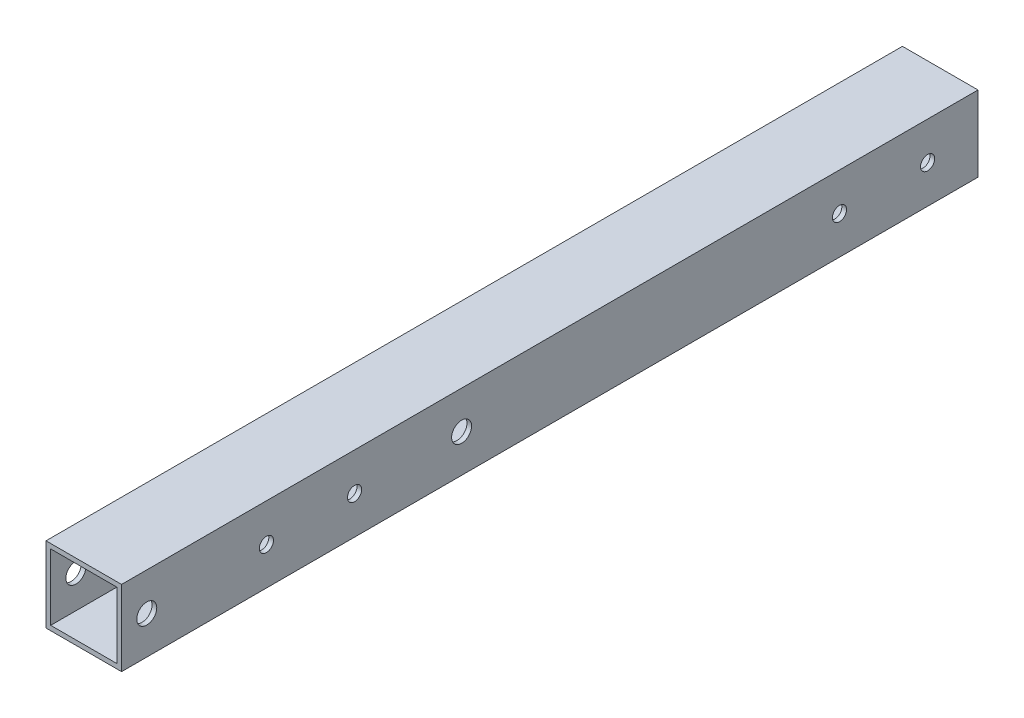
ISO-10303-21;
HEADER;
FILE_DESCRIPTION(('STEP AP214'),'2;1');
FILE_NAME('part.step','',(''),(''),'','','');
FILE_SCHEMA(('AUTOMOTIVE_DESIGN { 1 0 10303 214 1 1 1 1 }'));
ENDSEC;
DATA;
#1=APPLICATION_CONTEXT('core data for automotive mechanical design processes');
#2=APPLICATION_PROTOCOL_DEFINITION('international standard','automotive_design',2000,#1);
#3=PRODUCT_CONTEXT('',#1,'mechanical');
#4=PRODUCT('Part','Part','',(#3));
#5=PRODUCT_RELATED_PRODUCT_CATEGORY('part','',(#4));
#6=PRODUCT_DEFINITION_FORMATION('','',#4);
#7=PRODUCT_DEFINITION_CONTEXT('part definition',#1,'design');
#8=PRODUCT_DEFINITION('design','',#6,#7);
#9=PRODUCT_DEFINITION_SHAPE('','',#8);
#10=(LENGTH_UNIT() NAMED_UNIT(*) SI_UNIT(.MILLI.,.METRE.));
#11=(NAMED_UNIT(*) PLANE_ANGLE_UNIT() SI_UNIT($,.RADIAN.));
#12=(NAMED_UNIT(*) SI_UNIT($,.STERADIAN.) SOLID_ANGLE_UNIT());
#13=UNCERTAINTY_MEASURE_WITH_UNIT(LENGTH_MEASURE(1.E-05),#10,'distance_accuracy_value','');
#14=(GEOMETRIC_REPRESENTATION_CONTEXT(3) GLOBAL_UNCERTAINTY_ASSIGNED_CONTEXT((#13)) GLOBAL_UNIT_ASSIGNED_CONTEXT((#10,
#11,#12)) REPRESENTATION_CONTEXT('',''));
#15=CARTESIAN_POINT('',(0.,0.,0.));
#16=DIRECTION('',(0.,0.,1.));
#17=DIRECTION('',(1.,0.,0.));
#18=AXIS2_PLACEMENT_3D('',#15,#16,#17);
#19=CARTESIAN_POINT('',(19.05,19.05,431.8));
#20=DIRECTION('',(0.,0.,-1.));
#21=DIRECTION('',(-1.,0.,0.));
#22=AXIS2_PLACEMENT_3D('',#19,#20,#21);
#23=PLANE('',#22);
#24=DIRECTION('',(0.,1.,0.));
#25=VECTOR('',#24,1.);
#26=CARTESIAN_POINT('',(19.05,-19.05,431.8));
#27=LINE('',#26,#25);
#28=CARTESIAN_POINT('',(19.05,-19.05,431.8));
#29=VERTEX_POINT('',#28);
#30=CARTESIAN_POINT('',(19.05,19.05,431.8));
#31=VERTEX_POINT('',#30);
#32=EDGE_CURVE('E144',#29,#31,#27,.T.);
#33=ORIENTED_EDGE('',*,*,#32,.T.);
#34=DIRECTION('',(-1.,0.,0.));
#35=VECTOR('',#34,1.);
#36=CARTESIAN_POINT('',(-19.05,19.05,431.8));
#37=LINE('',#36,#35);
#38=CARTESIAN_POINT('',(-19.05,19.05,431.8));
#39=VERTEX_POINT('',#38);
#40=EDGE_CURVE('E147',#31,#39,#37,.T.);
#41=ORIENTED_EDGE('',*,*,#40,.T.);
#42=DIRECTION('',(0.,-1.,0.));
#43=VECTOR('',#42,1.);
#44=CARTESIAN_POINT('',(-19.05,-19.05,431.8));
#45=LINE('',#44,#43);
#46=CARTESIAN_POINT('',(-19.05,-19.05,431.8));
#47=VERTEX_POINT('',#46);
#48=EDGE_CURVE('E150',#39,#47,#45,.T.);
#49=ORIENTED_EDGE('',*,*,#48,.T.);
#50=DIRECTION('',(1.,0.,0.));
#51=VECTOR('',#50,1.);
#52=CARTESIAN_POINT('',(-19.05,-19.05,431.8));
#53=LINE('',#52,#51);
#54=EDGE_CURVE('E152',#47,#29,#53,.T.);
#55=ORIENTED_EDGE('',*,*,#54,.T.);
#56=EDGE_LOOP('',(#33,#41,#49,#55));
#57=FACE_BOUND('',#56,.T.);
#58=DIRECTION('',(0.,1.,0.));
#59=VECTOR('',#58,1.);
#60=CARTESIAN_POINT('',(16.6878,-16.6878,431.8));
#61=LINE('',#60,#59);
#62=CARTESIAN_POINT('',(16.6878,-16.6878,431.8));
#63=VERTEX_POINT('',#62);
#64=CARTESIAN_POINT('',(16.6878,16.6878,431.8));
#65=VERTEX_POINT('',#64);
#66=EDGE_CURVE('E106',#63,#65,#61,.T.);
#67=ORIENTED_EDGE('',*,*,#66,.F.);
#68=DIRECTION('',(1.,0.,0.));
#69=VECTOR('',#68,1.);
#70=CARTESIAN_POINT('',(-16.6878,-16.6878,431.8));
#71=LINE('',#70,#69);
#72=CARTESIAN_POINT('',(-16.6878,-16.6878,431.8));
#73=VERTEX_POINT('',#72);
#74=EDGE_CURVE('E128',#73,#63,#71,.T.);
#75=ORIENTED_EDGE('',*,*,#74,.F.);
#76=DIRECTION('',(0.,-1.,0.));
#77=VECTOR('',#76,1.);
#78=CARTESIAN_POINT('',(-16.6878,-16.6878,431.8));
#79=LINE('',#78,#77);
#80=CARTESIAN_POINT('',(-16.6878,16.6878,431.8));
#81=VERTEX_POINT('',#80);
#82=EDGE_CURVE('E126',#81,#73,#79,.T.);
#83=ORIENTED_EDGE('',*,*,#82,.F.);
#84=DIRECTION('',(-1.,0.,0.));
#85=VECTOR('',#84,1.);
#86=CARTESIAN_POINT('',(-16.6878,16.6878,431.8));
#87=LINE('',#86,#85);
#88=EDGE_CURVE('E114',#65,#81,#87,.T.);
#89=ORIENTED_EDGE('',*,*,#88,.F.);
#90=EDGE_LOOP('',(#67,#75,#83,#89));
#91=FACE_BOUND('',#90,.T.);
#92=ADVANCED_FACE('F39',(#57,#91),#23,.F.);
#93=CARTESIAN_POINT('',(19.05,19.05,0.));
#94=DIRECTION('',(0.,0.,-1.));
#95=DIRECTION('',(-1.,0.,0.));
#96=AXIS2_PLACEMENT_3D('',#93,#94,#95);
#97=PLANE('',#96);
#98=DIRECTION('',(0.,1.,0.));
#99=VECTOR('',#98,1.);
#100=CARTESIAN_POINT('',(19.05,-19.05,0.));
#101=LINE('',#100,#99);
#102=CARTESIAN_POINT('',(19.05,-19.05,0.));
#103=VERTEX_POINT('',#102);
#104=CARTESIAN_POINT('',(19.05,19.05,0.));
#105=VERTEX_POINT('',#104);
#106=EDGE_CURVE('E122',#103,#105,#101,.T.);
#107=ORIENTED_EDGE('',*,*,#106,.F.);
#108=DIRECTION('',(1.,0.,0.));
#109=VECTOR('',#108,1.);
#110=CARTESIAN_POINT('',(-19.05,-19.05,0.));
#111=LINE('',#110,#109);
#112=CARTESIAN_POINT('',(-19.05,-19.05,0.));
#113=VERTEX_POINT('',#112);
#114=EDGE_CURVE('E148',#113,#103,#111,.T.);
#115=ORIENTED_EDGE('',*,*,#114,.F.);
#116=DIRECTION('',(0.,-1.,0.));
#117=VECTOR('',#116,1.);
#118=CARTESIAN_POINT('',(-19.05,-19.05,0.));
#119=LINE('',#118,#117);
#120=CARTESIAN_POINT('',(-19.05,19.05,0.));
#121=VERTEX_POINT('',#120);
#122=EDGE_CURVE('E159',#121,#113,#119,.T.);
#123=ORIENTED_EDGE('',*,*,#122,.F.);
#124=DIRECTION('',(-1.,0.,0.));
#125=VECTOR('',#124,1.);
#126=CARTESIAN_POINT('',(-19.05,19.05,0.));
#127=LINE('',#126,#125);
#128=EDGE_CURVE('E157',#105,#121,#127,.T.);
#129=ORIENTED_EDGE('',*,*,#128,.F.);
#130=EDGE_LOOP('',(#107,#115,#123,#129));
#131=FACE_BOUND('',#130,.T.);
#132=DIRECTION('',(1.,0.,0.));
#133=VECTOR('',#132,1.);
#134=CARTESIAN_POINT('',(-16.6878,-16.6878,0.));
#135=LINE('',#134,#133);
#136=CARTESIAN_POINT('',(-16.6878,-16.6878,0.));
#137=VERTEX_POINT('',#136);
#138=CARTESIAN_POINT('',(16.6878,-16.6878,0.));
#139=VERTEX_POINT('',#138);
#140=EDGE_CURVE('E115',#137,#139,#135,.T.);
#141=ORIENTED_EDGE('',*,*,#140,.T.);
#142=DIRECTION('',(0.,1.,0.));
#143=VECTOR('',#142,1.);
#144=CARTESIAN_POINT('',(16.6878,-16.6878,0.));
#145=LINE('',#144,#143);
#146=CARTESIAN_POINT('',(16.6878,16.6878,0.));
#147=VERTEX_POINT('',#146);
#148=EDGE_CURVE('E64',#139,#147,#145,.T.);
#149=ORIENTED_EDGE('',*,*,#148,.T.);
#150=DIRECTION('',(-1.,0.,0.));
#151=VECTOR('',#150,1.);
#152=CARTESIAN_POINT('',(-16.6878,16.6878,0.));
#153=LINE('',#152,#151);
#154=CARTESIAN_POINT('',(-16.6878,16.6878,0.));
#155=VERTEX_POINT('',#154);
#156=EDGE_CURVE('E121',#147,#155,#153,.T.);
#157=ORIENTED_EDGE('',*,*,#156,.T.);
#158=DIRECTION('',(0.,-1.,0.));
#159=VECTOR('',#158,1.);
#160=CARTESIAN_POINT('',(-16.6878,-16.6878,0.));
#161=LINE('',#160,#159);
#162=EDGE_CURVE('E136',#155,#137,#161,.T.);
#163=ORIENTED_EDGE('',*,*,#162,.T.);
#164=EDGE_LOOP('',(#141,#149,#157,#163));
#165=FACE_BOUND('',#164,.T.);
#166=ADVANCED_FACE('F253',(#131,#165),#97,.T.);
#167=CARTESIAN_POINT('',(19.05,-19.05,431.8));
#168=DIRECTION('',(-1.,0.,0.));
#169=DIRECTION('',(0.,-1.,0.));
#170=AXIS2_PLACEMENT_3D('',#167,#168,#169);
#171=PLANE('',#170);
#172=CARTESIAN_POINT('',(19.05,0.,419.1));
#173=DIRECTION('',(1.,0.,0.));
#174=DIRECTION('',(0.,0.,-1.));
#175=AXIS2_PLACEMENT_3D('',#172,#173,#174);
#176=CIRCLE('',#175,5.04189999999999);
#177=CARTESIAN_POINT('',(19.05,0.,414.0581));
#178=VERTEX_POINT('',#177);
#179=EDGE_CURVE('E332',#178,#178,#176,.T.);
#180=ORIENTED_EDGE('',*,*,#179,.F.);
#181=EDGE_LOOP('',(#180));
#182=FACE_BOUND('',#181,.T.);
#183=CARTESIAN_POINT('',(19.05,0.,260.35));
#184=DIRECTION('',(1.,0.,0.));
#185=DIRECTION('',(0.,0.,-1.));
#186=AXIS2_PLACEMENT_3D('',#183,#184,#185);
#187=CIRCLE('',#186,5.04189999999999);
#188=CARTESIAN_POINT('',(19.05,0.,255.3081));
#189=VERTEX_POINT('',#188);
#190=EDGE_CURVE('E197',#189,#189,#187,.T.);
#191=ORIENTED_EDGE('',*,*,#190,.F.);
#192=EDGE_LOOP('',(#191));
#193=FACE_BOUND('',#192,.T.);
#194=CARTESIAN_POINT('',(19.05,0.,358.775));
#195=DIRECTION('',(1.,0.,0.));
#196=DIRECTION('',(0.,0.,-1.));
#197=AXIS2_PLACEMENT_3D('',#194,#195,#196);
#198=CIRCLE('',#197,3.57123999999999);
#199=CARTESIAN_POINT('',(19.05,0.,355.20376));
#200=VERTEX_POINT('',#199);
#201=EDGE_CURVE('E194',#200,#200,#198,.T.);
#202=ORIENTED_EDGE('',*,*,#201,.F.);
#203=EDGE_LOOP('',(#202));
#204=FACE_BOUND('',#203,.T.);
#205=CARTESIAN_POINT('',(19.05,0.,314.325));
#206=DIRECTION('',(1.,0.,0.));
#207=DIRECTION('',(0.,0.,-1.));
#208=AXIS2_PLACEMENT_3D('',#205,#206,#207);
#209=CIRCLE('',#208,3.57123999999999);
#210=CARTESIAN_POINT('',(19.05,0.,310.75376));
#211=VERTEX_POINT('',#210);
#212=EDGE_CURVE('E212',#211,#211,#209,.T.);
#213=ORIENTED_EDGE('',*,*,#212,.F.);
#214=EDGE_LOOP('',(#213));
#215=FACE_BOUND('',#214,.T.);
#216=CARTESIAN_POINT('',(19.05,0.,69.85));
#217=DIRECTION('',(1.,0.,0.));
#218=DIRECTION('',(0.,0.,-1.));
#219=AXIS2_PLACEMENT_3D('',#216,#217,#218);
#220=CIRCLE('',#219,3.57123999999999);
#221=CARTESIAN_POINT('',(19.05,0.,66.27876));
#222=VERTEX_POINT('',#221);
#223=EDGE_CURVE('E219',#222,#222,#220,.T.);
#224=ORIENTED_EDGE('',*,*,#223,.F.);
#225=EDGE_LOOP('',(#224));
#226=FACE_BOUND('',#225,.T.);
#227=CARTESIAN_POINT('',(19.05,0.,25.4));
#228=DIRECTION('',(1.,0.,0.));
#229=DIRECTION('',(0.,0.,-1.));
#230=AXIS2_PLACEMENT_3D('',#227,#228,#229);
#231=CIRCLE('',#230,3.57123999999999);
#232=CARTESIAN_POINT('',(19.05,0.,21.82876));
#233=VERTEX_POINT('',#232);
#234=EDGE_CURVE('E226',#233,#233,#231,.T.);
#235=ORIENTED_EDGE('',*,*,#234,.F.);
#236=EDGE_LOOP('',(#235));
#237=FACE_BOUND('',#236,.T.);
#238=ORIENTED_EDGE('',*,*,#106,.T.);
#239=DIRECTION('',(0.,0.,-1.));
#240=VECTOR('',#239,1.);
#241=CARTESIAN_POINT('',(19.05,19.05,431.8));
#242=LINE('',#241,#240);
#243=EDGE_CURVE('E11',#31,#105,#242,.T.);
#244=ORIENTED_EDGE('',*,*,#243,.F.);
#245=ORIENTED_EDGE('',*,*,#32,.F.);
#246=DIRECTION('',(0.,0.,-1.));
#247=VECTOR('',#246,1.);
#248=CARTESIAN_POINT('',(19.05,-19.05,431.8));
#249=LINE('',#248,#247);
#250=EDGE_CURVE('E154',#29,#103,#249,.T.);
#251=ORIENTED_EDGE('',*,*,#250,.T.);
#252=EDGE_LOOP('',(#238,#244,#245,#251));
#253=FACE_BOUND('',#252,.T.);
#254=ADVANCED_FACE('F41',(#182,#193,#204,#215,#226,#237,#253),#171,.F.);
#255=CARTESIAN_POINT('',(-19.05,19.05,431.8));
#256=DIRECTION('',(0.,-1.,0.));
#257=DIRECTION('',(1.,0.,0.));
#258=AXIS2_PLACEMENT_3D('',#255,#256,#257);
#259=PLANE('',#258);
#260=ORIENTED_EDGE('',*,*,#128,.T.);
#261=DIRECTION('',(0.,0.,-1.));
#262=VECTOR('',#261,1.);
#263=CARTESIAN_POINT('',(-19.05,19.05,431.8));
#264=LINE('',#263,#262);
#265=EDGE_CURVE('E48',#39,#121,#264,.T.);
#266=ORIENTED_EDGE('',*,*,#265,.F.);
#267=ORIENTED_EDGE('',*,*,#40,.F.);
#268=ORIENTED_EDGE('',*,*,#243,.T.);
#269=EDGE_LOOP('',(#260,#266,#267,#268));
#270=FACE_BOUND('',#269,.T.);
#271=ADVANCED_FACE('F262',(#270),#259,.F.);
#272=CARTESIAN_POINT('',(-19.05,-19.05,431.8));
#273=DIRECTION('',(1.,0.,0.));
#274=DIRECTION('',(0.,0.,-1.));
#275=AXIS2_PLACEMENT_3D('',#272,#273,#274);
#276=PLANE('',#275);
#277=CARTESIAN_POINT('',(-19.05,0.,419.1));
#278=DIRECTION('',(1.,0.,0.));
#279=DIRECTION('',(0.,0.,-1.));
#280=AXIS2_PLACEMENT_3D('',#277,#278,#279);
#281=CIRCLE('',#280,5.04189999999999);
#282=CARTESIAN_POINT('',(-19.05,0.,414.0581));
#283=VERTEX_POINT('',#282);
#284=EDGE_CURVE('E331',#283,#283,#281,.T.);
#285=ORIENTED_EDGE('',*,*,#284,.T.);
#286=EDGE_LOOP('',(#285));
#287=FACE_BOUND('',#286,.T.);
#288=CARTESIAN_POINT('',(-19.05,0.,260.35));
#289=DIRECTION('',(1.,0.,0.));
#290=DIRECTION('',(0.,0.,-1.));
#291=AXIS2_PLACEMENT_3D('',#288,#289,#290);
#292=CIRCLE('',#291,5.04189999999999);
#293=CARTESIAN_POINT('',(-19.05,0.,255.3081));
#294=VERTEX_POINT('',#293);
#295=EDGE_CURVE('E190',#294,#294,#292,.T.);
#296=ORIENTED_EDGE('',*,*,#295,.T.);
#297=EDGE_LOOP('',(#296));
#298=FACE_BOUND('',#297,.T.);
#299=CARTESIAN_POINT('',(-19.05,0.,358.775));
#300=DIRECTION('',(1.,0.,0.));
#301=DIRECTION('',(0.,0.,-1.));
#302=AXIS2_PLACEMENT_3D('',#299,#300,#301);
#303=CIRCLE('',#302,3.57123999999999);
#304=CARTESIAN_POINT('',(-19.05,0.,355.20376));
#305=VERTEX_POINT('',#304);
#306=EDGE_CURVE('E186',#305,#305,#303,.T.);
#307=ORIENTED_EDGE('',*,*,#306,.T.);
#308=EDGE_LOOP('',(#307));
#309=FACE_BOUND('',#308,.T.);
#310=CARTESIAN_POINT('',(-19.05,0.,314.325));
#311=DIRECTION('',(1.,0.,0.));
#312=DIRECTION('',(0.,0.,-1.));
#313=AXIS2_PLACEMENT_3D('',#310,#311,#312);
#314=CIRCLE('',#313,3.57123999999999);
#315=CARTESIAN_POINT('',(-19.05,0.,310.75376));
#316=VERTEX_POINT('',#315);
#317=EDGE_CURVE('E182',#316,#316,#314,.T.);
#318=ORIENTED_EDGE('',*,*,#317,.T.);
#319=EDGE_LOOP('',(#318));
#320=FACE_BOUND('',#319,.T.);
#321=CARTESIAN_POINT('',(-19.05,0.,69.85));
#322=DIRECTION('',(1.,0.,0.));
#323=DIRECTION('',(0.,0.,-1.));
#324=AXIS2_PLACEMENT_3D('',#321,#322,#323);
#325=CIRCLE('',#324,3.57123999999999);
#326=CARTESIAN_POINT('',(-19.05,0.,66.27876));
#327=VERTEX_POINT('',#326);
#328=EDGE_CURVE('E177',#327,#327,#325,.T.);
#329=ORIENTED_EDGE('',*,*,#328,.T.);
#330=EDGE_LOOP('',(#329));
#331=FACE_BOUND('',#330,.T.);
#332=CARTESIAN_POINT('',(-19.05,0.,25.4));
#333=DIRECTION('',(1.,0.,0.));
#334=DIRECTION('',(0.,0.,-1.));
#335=AXIS2_PLACEMENT_3D('',#332,#333,#334);
#336=CIRCLE('',#335,3.57123999999999);
#337=CARTESIAN_POINT('',(-19.05,0.,21.82876));
#338=VERTEX_POINT('',#337);
#339=EDGE_CURVE('E172',#338,#338,#336,.T.);
#340=ORIENTED_EDGE('',*,*,#339,.T.);
#341=EDGE_LOOP('',(#340));
#342=FACE_BOUND('',#341,.T.);
#343=ORIENTED_EDGE('',*,*,#122,.T.);
#344=DIRECTION('',(0.,0.,-1.));
#345=VECTOR('',#344,1.);
#346=CARTESIAN_POINT('',(-19.05,-19.05,431.8));
#347=LINE('',#346,#345);
#348=EDGE_CURVE('E164',#47,#113,#347,.T.);
#349=ORIENTED_EDGE('',*,*,#348,.F.);
#350=ORIENTED_EDGE('',*,*,#48,.F.);
#351=ORIENTED_EDGE('',*,*,#265,.T.);
#352=EDGE_LOOP('',(#343,#349,#350,#351));
#353=FACE_BOUND('',#352,.T.);
#354=ADVANCED_FACE('F246',(#287,#298,#309,#320,#331,#342,#353),#276,.F.);
#355=CARTESIAN_POINT('',(-19.05,-19.05,431.8));
#356=DIRECTION('',(0.,1.,0.));
#357=DIRECTION('',(0.,0.,1.));
#358=AXIS2_PLACEMENT_3D('',#355,#356,#357);
#359=PLANE('',#358);
#360=ORIENTED_EDGE('',*,*,#114,.T.);
#361=ORIENTED_EDGE('',*,*,#250,.F.);
#362=ORIENTED_EDGE('',*,*,#54,.F.);
#363=ORIENTED_EDGE('',*,*,#348,.T.);
#364=EDGE_LOOP('',(#360,#361,#362,#363));
#365=FACE_BOUND('',#364,.T.);
#366=ADVANCED_FACE('F237',(#365),#359,.F.);
#367=CARTESIAN_POINT('',(16.6878,-16.6878,431.8));
#368=DIRECTION('',(-1.,0.,0.));
#369=DIRECTION('',(0.,0.,1.));
#370=AXIS2_PLACEMENT_3D('',#367,#368,#369);
#371=PLANE('',#370);
#372=CARTESIAN_POINT('',(16.6878,0.,419.1));
#373=DIRECTION('',(-1.,0.,0.));
#374=DIRECTION('',(0.,0.,1.));
#375=AXIS2_PLACEMENT_3D('',#372,#373,#374);
#376=CIRCLE('',#375,5.04189999999999);
#377=CARTESIAN_POINT('',(16.6878,0.,424.1419));
#378=VERTEX_POINT('',#377);
#379=EDGE_CURVE('E202',#378,#378,#376,.T.);
#380=ORIENTED_EDGE('',*,*,#379,.F.);
#381=EDGE_LOOP('',(#380));
#382=FACE_BOUND('',#381,.T.);
#383=CARTESIAN_POINT('',(16.6878,0.,260.35));
#384=DIRECTION('',(-1.,0.,0.));
#385=DIRECTION('',(0.,0.,1.));
#386=AXIS2_PLACEMENT_3D('',#383,#384,#385);
#387=CIRCLE('',#386,5.04189999999999);
#388=CARTESIAN_POINT('',(16.6878,0.,265.3919));
#389=VERTEX_POINT('',#388);
#390=EDGE_CURVE('E189',#389,#389,#387,.T.);
#391=ORIENTED_EDGE('',*,*,#390,.F.);
#392=EDGE_LOOP('',(#391));
#393=FACE_BOUND('',#392,.T.);
#394=CARTESIAN_POINT('',(16.6878,0.,358.775));
#395=DIRECTION('',(-1.,0.,0.));
#396=DIRECTION('',(0.,0.,1.));
#397=AXIS2_PLACEMENT_3D('',#394,#395,#396);
#398=CIRCLE('',#397,3.57123999999999);
#399=CARTESIAN_POINT('',(16.6878,0.,362.34624));
#400=VERTEX_POINT('',#399);
#401=EDGE_CURVE('E185',#400,#400,#398,.T.);
#402=ORIENTED_EDGE('',*,*,#401,.F.);
#403=EDGE_LOOP('',(#402));
#404=FACE_BOUND('',#403,.T.);
#405=CARTESIAN_POINT('',(16.6878,0.,314.325));
#406=DIRECTION('',(-1.,0.,0.));
#407=DIRECTION('',(0.,0.,1.));
#408=AXIS2_PLACEMENT_3D('',#405,#406,#407);
#409=CIRCLE('',#408,3.57123999999999);
#410=CARTESIAN_POINT('',(16.6878,0.,317.89624));
#411=VERTEX_POINT('',#410);
#412=EDGE_CURVE('E181',#411,#411,#409,.T.);
#413=ORIENTED_EDGE('',*,*,#412,.F.);
#414=EDGE_LOOP('',(#413));
#415=FACE_BOUND('',#414,.T.);
#416=CARTESIAN_POINT('',(16.6878,0.,69.85));
#417=DIRECTION('',(-1.,0.,0.));
#418=DIRECTION('',(0.,0.,1.));
#419=AXIS2_PLACEMENT_3D('',#416,#417,#418);
#420=CIRCLE('',#419,3.57123999999999);
#421=CARTESIAN_POINT('',(16.6878,0.,73.42124));
#422=VERTEX_POINT('',#421);
#423=EDGE_CURVE('E176',#422,#422,#420,.T.);
#424=ORIENTED_EDGE('',*,*,#423,.F.);
#425=EDGE_LOOP('',(#424));
#426=FACE_BOUND('',#425,.T.);
#427=CARTESIAN_POINT('',(16.6878,0.,25.4));
#428=DIRECTION('',(-1.,0.,0.));
#429=DIRECTION('',(0.,0.,1.));
#430=AXIS2_PLACEMENT_3D('',#427,#428,#429);
#431=CIRCLE('',#430,3.57123999999999);
#432=CARTESIAN_POINT('',(16.6878,0.,28.97124));
#433=VERTEX_POINT('',#432);
#434=EDGE_CURVE('E134',#433,#433,#431,.T.);
#435=ORIENTED_EDGE('',*,*,#434,.F.);
#436=EDGE_LOOP('',(#435));
#437=FACE_BOUND('',#436,.T.);
#438=ORIENTED_EDGE('',*,*,#148,.F.);
#439=DIRECTION('',(0.,0.,-1.));
#440=VECTOR('',#439,1.);
#441=CARTESIAN_POINT('',(16.6878,-16.6878,431.8));
#442=LINE('',#441,#440);
#443=EDGE_CURVE('E110',#63,#139,#442,.T.);
#444=ORIENTED_EDGE('',*,*,#443,.F.);
#445=ORIENTED_EDGE('',*,*,#66,.T.);
#446=DIRECTION('',(0.,0.,-1.));
#447=VECTOR('',#446,1.);
#448=CARTESIAN_POINT('',(16.6878,16.6878,431.8));
#449=LINE('',#448,#447);
#450=EDGE_CURVE('E109',#65,#147,#449,.T.);
#451=ORIENTED_EDGE('',*,*,#450,.T.);
#452=EDGE_LOOP('',(#438,#444,#445,#451));
#453=FACE_BOUND('',#452,.T.);
#454=ADVANCED_FACE('F108',(#382,#393,#404,#415,#426,#437,#453),#371,.T.);
#455=CARTESIAN_POINT('',(-16.6878,16.6878,431.8));
#456=DIRECTION('',(0.,-1.,0.));
#457=DIRECTION('',(0.,0.,-1.));
#458=AXIS2_PLACEMENT_3D('',#455,#456,#457);
#459=PLANE('',#458);
#460=ORIENTED_EDGE('',*,*,#156,.F.);
#461=ORIENTED_EDGE('',*,*,#450,.F.);
#462=ORIENTED_EDGE('',*,*,#88,.T.);
#463=DIRECTION('',(0.,0.,-1.));
#464=VECTOR('',#463,1.);
#465=CARTESIAN_POINT('',(-16.6878,16.6878,431.8));
#466=LINE('',#465,#464);
#467=EDGE_CURVE('E123',#81,#155,#466,.T.);
#468=ORIENTED_EDGE('',*,*,#467,.T.);
#469=EDGE_LOOP('',(#460,#461,#462,#468));
#470=FACE_BOUND('',#469,.T.);
#471=ADVANCED_FACE('F118',(#470),#459,.T.);
#472=CARTESIAN_POINT('',(-16.6878,-16.6878,431.8));
#473=DIRECTION('',(1.,0.,0.));
#474=DIRECTION('',(0.,0.,-1.));
#475=AXIS2_PLACEMENT_3D('',#472,#473,#474);
#476=PLANE('',#475);
#477=CARTESIAN_POINT('',(-16.6878,0.,419.1));
#478=DIRECTION('',(1.,0.,0.));
#479=DIRECTION('',(0.,0.,-1.));
#480=AXIS2_PLACEMENT_3D('',#477,#478,#479);
#481=CIRCLE('',#480,5.04189999999999);
#482=CARTESIAN_POINT('',(-16.6878,0.,414.0581));
#483=VERTEX_POINT('',#482);
#484=EDGE_CURVE('E43',#483,#483,#481,.T.);
#485=ORIENTED_EDGE('',*,*,#484,.F.);
#486=EDGE_LOOP('',(#485));
#487=FACE_BOUND('',#486,.T.);
#488=CARTESIAN_POINT('',(-16.6878,0.,260.35));
#489=DIRECTION('',(1.,0.,0.));
#490=DIRECTION('',(0.,0.,-1.));
#491=AXIS2_PLACEMENT_3D('',#488,#489,#490);
#492=CIRCLE('',#491,5.04189999999999);
#493=CARTESIAN_POINT('',(-16.6878,0.,255.3081));
#494=VERTEX_POINT('',#493);
#495=EDGE_CURVE('E187',#494,#494,#492,.T.);
#496=ORIENTED_EDGE('',*,*,#495,.F.);
#497=EDGE_LOOP('',(#496));
#498=FACE_BOUND('',#497,.T.);
#499=CARTESIAN_POINT('',(-16.6878,0.,358.775));
#500=DIRECTION('',(1.,0.,0.));
#501=DIRECTION('',(0.,0.,-1.));
#502=AXIS2_PLACEMENT_3D('',#499,#500,#501);
#503=CIRCLE('',#502,3.57123999999999);
#504=CARTESIAN_POINT('',(-16.6878,0.,355.20376));
#505=VERTEX_POINT('',#504);
#506=EDGE_CURVE('E183',#505,#505,#503,.T.);
#507=ORIENTED_EDGE('',*,*,#506,.F.);
#508=EDGE_LOOP('',(#507));
#509=FACE_BOUND('',#508,.T.);
#510=CARTESIAN_POINT('',(-16.6878,0.,314.325));
#511=DIRECTION('',(1.,0.,0.));
#512=DIRECTION('',(0.,0.,-1.));
#513=AXIS2_PLACEMENT_3D('',#510,#511,#512);
#514=CIRCLE('',#513,3.57123999999999);
#515=CARTESIAN_POINT('',(-16.6878,0.,310.75376));
#516=VERTEX_POINT('',#515);
#517=EDGE_CURVE('E178',#516,#516,#514,.T.);
#518=ORIENTED_EDGE('',*,*,#517,.F.);
#519=EDGE_LOOP('',(#518));
#520=FACE_BOUND('',#519,.T.);
#521=CARTESIAN_POINT('',(-16.6878,0.,69.85));
#522=DIRECTION('',(1.,0.,0.));
#523=DIRECTION('',(0.,0.,-1.));
#524=AXIS2_PLACEMENT_3D('',#521,#522,#523);
#525=CIRCLE('',#524,3.57123999999999);
#526=CARTESIAN_POINT('',(-16.6878,0.,66.27876));
#527=VERTEX_POINT('',#526);
#528=EDGE_CURVE('E173',#527,#527,#525,.T.);
#529=ORIENTED_EDGE('',*,*,#528,.F.);
#530=EDGE_LOOP('',(#529));
#531=FACE_BOUND('',#530,.T.);
#532=CARTESIAN_POINT('',(-16.6878,0.,25.4));
#533=DIRECTION('',(1.,0.,0.));
#534=DIRECTION('',(0.,0.,-1.));
#535=AXIS2_PLACEMENT_3D('',#532,#533,#534);
#536=CIRCLE('',#535,3.57123999999999);
#537=CARTESIAN_POINT('',(-16.6878,0.,21.82876));
#538=VERTEX_POINT('',#537);
#539=EDGE_CURVE('E169',#538,#538,#536,.T.);
#540=ORIENTED_EDGE('',*,*,#539,.F.);
#541=EDGE_LOOP('',(#540));
#542=FACE_BOUND('',#541,.T.);
#543=ORIENTED_EDGE('',*,*,#162,.F.);
#544=ORIENTED_EDGE('',*,*,#467,.F.);
#545=ORIENTED_EDGE('',*,*,#82,.T.);
#546=DIRECTION('',(0.,0.,-1.));
#547=VECTOR('',#546,1.);
#548=CARTESIAN_POINT('',(-16.6878,-16.6878,431.8));
#549=LINE('',#548,#547);
#550=EDGE_CURVE('E56',#73,#137,#549,.T.);
#551=ORIENTED_EDGE('',*,*,#550,.T.);
#552=EDGE_LOOP('',(#543,#544,#545,#551));
#553=FACE_BOUND('',#552,.T.);
#554=ADVANCED_FACE('F244',(#487,#498,#509,#520,#531,#542,#553),#476,.T.);
#555=CARTESIAN_POINT('',(-16.6878,-16.6878,431.8));
#556=DIRECTION('',(0.,1.,0.));
#557=DIRECTION('',(-1.,0.,0.));
#558=AXIS2_PLACEMENT_3D('',#555,#556,#557);
#559=PLANE('',#558);
#560=ORIENTED_EDGE('',*,*,#140,.F.);
#561=ORIENTED_EDGE('',*,*,#550,.F.);
#562=ORIENTED_EDGE('',*,*,#74,.T.);
#563=ORIENTED_EDGE('',*,*,#443,.T.);
#564=EDGE_LOOP('',(#560,#561,#562,#563));
#565=FACE_BOUND('',#564,.T.);
#566=ADVANCED_FACE('F284',(#565),#559,.T.);
#567=CARTESIAN_POINT('',(19.05,0.,25.4));
#568=DIRECTION('',(1.,0.,0.));
#569=DIRECTION('',(0.,0.,-1.));
#570=AXIS2_PLACEMENT_3D('',#567,#568,#569);
#571=CYLINDRICAL_SURFACE('',#570,3.57123999999999);
#572=ORIENTED_EDGE('',*,*,#539,.T.);
#573=EDGE_LOOP('',(#572));
#574=FACE_BOUND('',#573,.T.);
#575=ORIENTED_EDGE('',*,*,#339,.F.);
#576=EDGE_LOOP('',(#575));
#577=FACE_BOUND('',#576,.T.);
#578=ADVANCED_FACE('F286',(#574,#577),#571,.F.);
#579=ORIENTED_EDGE('',*,*,#434,.T.);
#580=EDGE_LOOP('',(#579));
#581=FACE_BOUND('',#580,.T.);
#582=ORIENTED_EDGE('',*,*,#234,.T.);
#583=EDGE_LOOP('',(#582));
#584=FACE_BOUND('',#583,.T.);
#585=ADVANCED_FACE('F233',(#581,#584),#571,.F.);
#586=CARTESIAN_POINT('',(19.05,0.,69.85));
#587=DIRECTION('',(1.,0.,0.));
#588=DIRECTION('',(0.,0.,-1.));
#589=AXIS2_PLACEMENT_3D('',#586,#587,#588);
#590=CYLINDRICAL_SURFACE('',#589,3.57123999999999);
#591=ORIENTED_EDGE('',*,*,#528,.T.);
#592=EDGE_LOOP('',(#591));
#593=FACE_BOUND('',#592,.T.);
#594=ORIENTED_EDGE('',*,*,#328,.F.);
#595=EDGE_LOOP('',(#594));
#596=FACE_BOUND('',#595,.T.);
#597=ADVANCED_FACE('F297',(#593,#596),#590,.F.);
#598=ORIENTED_EDGE('',*,*,#423,.T.);
#599=EDGE_LOOP('',(#598));
#600=FACE_BOUND('',#599,.T.);
#601=ORIENTED_EDGE('',*,*,#223,.T.);
#602=EDGE_LOOP('',(#601));
#603=FACE_BOUND('',#602,.T.);
#604=ADVANCED_FACE('F300',(#600,#603),#590,.F.);
#605=CARTESIAN_POINT('',(19.05,0.,314.325));
#606=DIRECTION('',(1.,0.,0.));
#607=DIRECTION('',(0.,0.,-1.));
#608=AXIS2_PLACEMENT_3D('',#605,#606,#607);
#609=CYLINDRICAL_SURFACE('',#608,3.57123999999999);
#610=ORIENTED_EDGE('',*,*,#517,.T.);
#611=EDGE_LOOP('',(#610));
#612=FACE_BOUND('',#611,.T.);
#613=ORIENTED_EDGE('',*,*,#317,.F.);
#614=EDGE_LOOP('',(#613));
#615=FACE_BOUND('',#614,.T.);
#616=ADVANCED_FACE('F302',(#612,#615),#609,.F.);
#617=ORIENTED_EDGE('',*,*,#412,.T.);
#618=EDGE_LOOP('',(#617));
#619=FACE_BOUND('',#618,.T.);
#620=ORIENTED_EDGE('',*,*,#212,.T.);
#621=EDGE_LOOP('',(#620));
#622=FACE_BOUND('',#621,.T.);
#623=ADVANCED_FACE('F305',(#619,#622),#609,.F.);
#624=CARTESIAN_POINT('',(19.05,0.,358.775));
#625=DIRECTION('',(1.,0.,0.));
#626=DIRECTION('',(0.,0.,-1.));
#627=AXIS2_PLACEMENT_3D('',#624,#625,#626);
#628=CYLINDRICAL_SURFACE('',#627,3.57123999999999);
#629=ORIENTED_EDGE('',*,*,#506,.T.);
#630=EDGE_LOOP('',(#629));
#631=FACE_BOUND('',#630,.T.);
#632=ORIENTED_EDGE('',*,*,#306,.F.);
#633=EDGE_LOOP('',(#632));
#634=FACE_BOUND('',#633,.T.);
#635=ADVANCED_FACE('F307',(#631,#634),#628,.F.);
#636=ORIENTED_EDGE('',*,*,#401,.T.);
#637=EDGE_LOOP('',(#636));
#638=FACE_BOUND('',#637,.T.);
#639=ORIENTED_EDGE('',*,*,#201,.T.);
#640=EDGE_LOOP('',(#639));
#641=FACE_BOUND('',#640,.T.);
#642=ADVANCED_FACE('F310',(#638,#641),#628,.F.);
#643=CARTESIAN_POINT('',(19.05,0.,260.35));
#644=DIRECTION('',(1.,0.,0.));
#645=DIRECTION('',(0.,0.,-1.));
#646=AXIS2_PLACEMENT_3D('',#643,#644,#645);
#647=CYLINDRICAL_SURFACE('',#646,5.04189999999999);
#648=ORIENTED_EDGE('',*,*,#495,.T.);
#649=EDGE_LOOP('',(#648));
#650=FACE_BOUND('',#649,.T.);
#651=ORIENTED_EDGE('',*,*,#295,.F.);
#652=EDGE_LOOP('',(#651));
#653=FACE_BOUND('',#652,.T.);
#654=ADVANCED_FACE('F312',(#650,#653),#647,.F.);
#655=ORIENTED_EDGE('',*,*,#390,.T.);
#656=EDGE_LOOP('',(#655));
#657=FACE_BOUND('',#656,.T.);
#658=ORIENTED_EDGE('',*,*,#190,.T.);
#659=EDGE_LOOP('',(#658));
#660=FACE_BOUND('',#659,.T.);
#661=ADVANCED_FACE('F315',(#657,#660),#647,.F.);
#662=CARTESIAN_POINT('',(19.05,0.,419.1));
#663=DIRECTION('',(1.,0.,0.));
#664=DIRECTION('',(0.,0.,-1.));
#665=AXIS2_PLACEMENT_3D('',#662,#663,#664);
#666=CYLINDRICAL_SURFACE('',#665,5.04189999999999);
#667=ORIENTED_EDGE('',*,*,#484,.T.);
#668=EDGE_LOOP('',(#667));
#669=FACE_BOUND('',#668,.T.);
#670=ORIENTED_EDGE('',*,*,#284,.F.);
#671=EDGE_LOOP('',(#670));
#672=FACE_BOUND('',#671,.T.);
#673=ADVANCED_FACE('F316',(#669,#672),#666,.F.);
#674=ORIENTED_EDGE('',*,*,#379,.T.);
#675=EDGE_LOOP('',(#674));
#676=FACE_BOUND('',#675,.T.);
#677=ORIENTED_EDGE('',*,*,#179,.T.);
#678=EDGE_LOOP('',(#677));
#679=FACE_BOUND('',#678,.T.);
#680=ADVANCED_FACE('F318',(#676,#679),#666,.F.);
#681=CLOSED_SHELL('',(#92,#166,#254,#271,#354,#366,#454,#471,#554,#566,#578,#585,#597,#604,#616,
#623,#635,#642,#654,#661,#673,#680));
#682=MANIFOLD_SOLID_BREP('B2',#681);
#683=ADVANCED_BREP_SHAPE_REPRESENTATION('',(#18,#682),#14);
#684=SHAPE_DEFINITION_REPRESENTATION(#9,#683);
ENDSEC;
END-ISO-10303-21;
